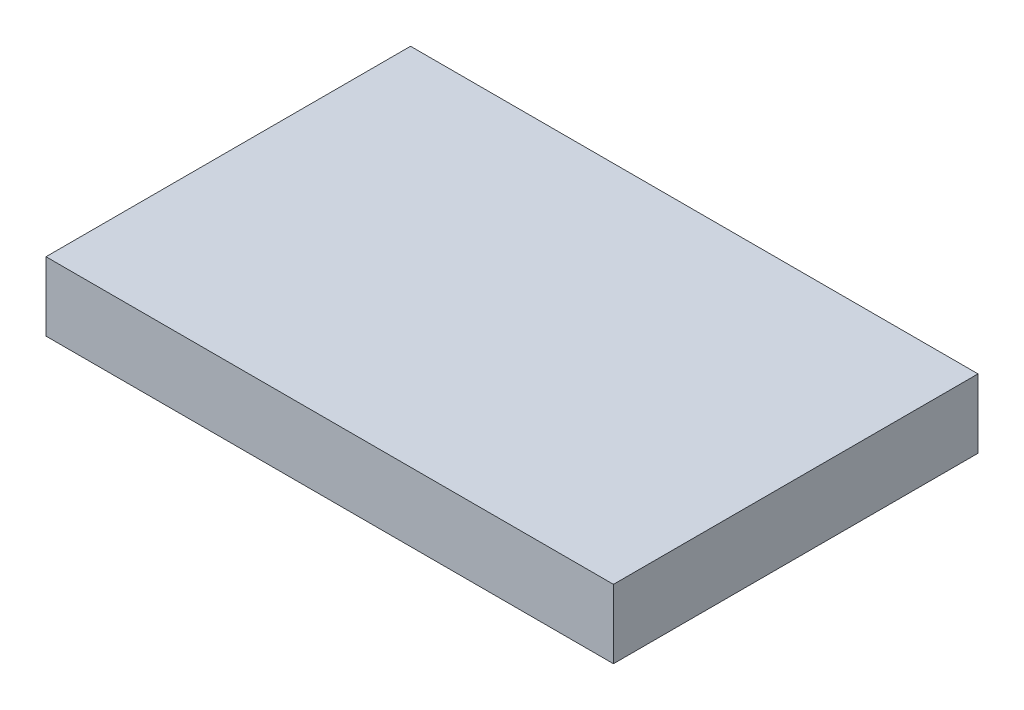
ISO-10303-21;
HEADER;
FILE_DESCRIPTION(('STEP AP214'),'2;1');
FILE_NAME('part.step','',(''),(''),'','','');
FILE_SCHEMA(('AUTOMOTIVE_DESIGN { 1 0 10303 214 1 1 1 1 }'));
ENDSEC;
DATA;
#1=APPLICATION_CONTEXT('core data for automotive mechanical design processes');
#2=APPLICATION_PROTOCOL_DEFINITION('international standard','automotive_design',2000,#1);
#3=PRODUCT_CONTEXT('',#1,'mechanical');
#4=PRODUCT('Part','Part','',(#3));
#5=PRODUCT_RELATED_PRODUCT_CATEGORY('part','',(#4));
#6=PRODUCT_DEFINITION_FORMATION('','',#4);
#7=PRODUCT_DEFINITION_CONTEXT('part definition',#1,'design');
#8=PRODUCT_DEFINITION('design','',#6,#7);
#9=PRODUCT_DEFINITION_SHAPE('','',#8);
#10=(LENGTH_UNIT() NAMED_UNIT(*) SI_UNIT(.MILLI.,.METRE.));
#11=(NAMED_UNIT(*) PLANE_ANGLE_UNIT() SI_UNIT($,.RADIAN.));
#12=(NAMED_UNIT(*) SI_UNIT($,.STERADIAN.) SOLID_ANGLE_UNIT());
#13=UNCERTAINTY_MEASURE_WITH_UNIT(LENGTH_MEASURE(1.E-05),#10,'distance_accuracy_value','');
#14=(GEOMETRIC_REPRESENTATION_CONTEXT(3) GLOBAL_UNCERTAINTY_ASSIGNED_CONTEXT((#13)) GLOBAL_UNIT_ASSIGNED_CONTEXT((#10,
#11,#12)) REPRESENTATION_CONTEXT('',''));
#15=CARTESIAN_POINT('',(0.,0.,0.));
#16=DIRECTION('',(0.,0.,1.));
#17=DIRECTION('',(1.,0.,0.));
#18=AXIS2_PLACEMENT_3D('',#15,#16,#17);
#19=CARTESIAN_POINT('',(41.25,10.,-26.5));
#20=DIRECTION('',(-1.,0.,0.));
#21=DIRECTION('',(0.,0.,1.));
#22=AXIS2_PLACEMENT_3D('',#19,#20,#21);
#23=PLANE('',#22);
#24=DIRECTION('',(0.,0.,-1.));
#25=VECTOR('',#24,1.);
#26=CARTESIAN_POINT('',(41.25,0.,-26.5));
#27=LINE('',#26,#25);
#28=CARTESIAN_POINT('',(41.25,0.,26.5));
#29=VERTEX_POINT('',#28);
#30=CARTESIAN_POINT('',(41.25,0.,-26.5));
#31=VERTEX_POINT('',#30);
#32=EDGE_CURVE('E107',#29,#31,#27,.T.);
#33=ORIENTED_EDGE('',*,*,#32,.T.);
#34=DIRECTION('',(0.,-1.,0.));
#35=VECTOR('',#34,1.);
#36=CARTESIAN_POINT('',(41.25,10.,-26.5));
#37=LINE('',#36,#35);
#38=CARTESIAN_POINT('',(41.25,10.,-26.5));
#39=VERTEX_POINT('',#38);
#40=EDGE_CURVE('E11',#39,#31,#37,.T.);
#41=ORIENTED_EDGE('',*,*,#40,.F.);
#42=DIRECTION('',(0.,0.,-1.));
#43=VECTOR('',#42,1.);
#44=CARTESIAN_POINT('',(41.25,10.,-26.5));
#45=LINE('',#44,#43);
#46=CARTESIAN_POINT('',(41.25,10.,26.5));
#47=VERTEX_POINT('',#46);
#48=EDGE_CURVE('E91',#47,#39,#45,.T.);
#49=ORIENTED_EDGE('',*,*,#48,.F.);
#50=DIRECTION('',(0.,-1.,0.));
#51=VECTOR('',#50,1.);
#52=CARTESIAN_POINT('',(41.25,10.,26.5));
#53=LINE('',#52,#51);
#54=EDGE_CURVE('E103',#47,#29,#53,.T.);
#55=ORIENTED_EDGE('',*,*,#54,.T.);
#56=EDGE_LOOP('',(#33,#41,#49,#55));
#57=FACE_BOUND('',#56,.T.);
#58=ADVANCED_FACE('F39',(#57),#23,.F.);
#59=CARTESIAN_POINT('',(-41.25,10.,-26.5));
#60=DIRECTION('',(0.,0.,1.));
#61=DIRECTION('',(1.,0.,0.));
#62=AXIS2_PLACEMENT_3D('',#59,#60,#61);
#63=PLANE('',#62);
#64=DIRECTION('',(-1.,0.,0.));
#65=VECTOR('',#64,1.);
#66=CARTESIAN_POINT('',(-41.25,0.,-26.5));
#67=LINE('',#66,#65);
#68=CARTESIAN_POINT('',(-41.25,0.,-26.5));
#69=VERTEX_POINT('',#68);
#70=EDGE_CURVE('E96',#31,#69,#67,.T.);
#71=ORIENTED_EDGE('',*,*,#70,.T.);
#72=DIRECTION('',(0.,-1.,0.));
#73=VECTOR('',#72,1.);
#74=CARTESIAN_POINT('',(-41.25,10.,-26.5));
#75=LINE('',#74,#73);
#76=CARTESIAN_POINT('',(-41.25,10.,-26.5));
#77=VERTEX_POINT('',#76);
#78=EDGE_CURVE('E48',#77,#69,#75,.T.);
#79=ORIENTED_EDGE('',*,*,#78,.F.);
#80=DIRECTION('',(-1.,0.,0.));
#81=VECTOR('',#80,1.);
#82=CARTESIAN_POINT('',(-41.25,10.,-26.5));
#83=LINE('',#82,#81);
#84=EDGE_CURVE('E86',#39,#77,#83,.T.);
#85=ORIENTED_EDGE('',*,*,#84,.F.);
#86=ORIENTED_EDGE('',*,*,#40,.T.);
#87=EDGE_LOOP('',(#71,#79,#85,#86));
#88=FACE_BOUND('',#87,.T.);
#89=ADVANCED_FACE('F95',(#88),#63,.F.);
#90=CARTESIAN_POINT('',(-41.25,10.,-26.5));
#91=DIRECTION('',(1.,0.,0.));
#92=DIRECTION('',(0.,0.,-1.));
#93=AXIS2_PLACEMENT_3D('',#90,#91,#92);
#94=PLANE('',#93);
#95=DIRECTION('',(0.,0.,1.));
#96=VECTOR('',#95,1.);
#97=CARTESIAN_POINT('',(-41.25,0.,-26.5));
#98=LINE('',#97,#96);
#99=CARTESIAN_POINT('',(-41.25,0.,26.5));
#100=VERTEX_POINT('',#99);
#101=EDGE_CURVE('E73',#69,#100,#98,.T.);
#102=ORIENTED_EDGE('',*,*,#101,.T.);
#103=DIRECTION('',(0.,-1.,0.));
#104=VECTOR('',#103,1.);
#105=CARTESIAN_POINT('',(-41.25,10.,26.5));
#106=LINE('',#105,#104);
#107=CARTESIAN_POINT('',(-41.25,10.,26.5));
#108=VERTEX_POINT('',#107);
#109=EDGE_CURVE('E98',#108,#100,#106,.T.);
#110=ORIENTED_EDGE('',*,*,#109,.F.);
#111=DIRECTION('',(0.,0.,1.));
#112=VECTOR('',#111,1.);
#113=CARTESIAN_POINT('',(-41.25,10.,-26.5));
#114=LINE('',#113,#112);
#115=EDGE_CURVE('E89',#77,#108,#114,.T.);
#116=ORIENTED_EDGE('',*,*,#115,.F.);
#117=ORIENTED_EDGE('',*,*,#78,.T.);
#118=EDGE_LOOP('',(#102,#110,#116,#117));
#119=FACE_BOUND('',#118,.T.);
#120=ADVANCED_FACE('F99',(#119),#94,.F.);
#121=CARTESIAN_POINT('',(-41.25,10.,26.5));
#122=DIRECTION('',(0.,0.,-1.));
#123=DIRECTION('',(-1.,0.,0.));
#124=AXIS2_PLACEMENT_3D('',#121,#122,#123);
#125=PLANE('',#124);
#126=DIRECTION('',(1.,0.,0.));
#127=VECTOR('',#126,1.);
#128=CARTESIAN_POINT('',(-41.25,0.,26.5));
#129=LINE('',#128,#127);
#130=EDGE_CURVE('E79',#100,#29,#129,.T.);
#131=ORIENTED_EDGE('',*,*,#130,.T.);
#132=ORIENTED_EDGE('',*,*,#54,.F.);
#133=DIRECTION('',(1.,0.,0.));
#134=VECTOR('',#133,1.);
#135=CARTESIAN_POINT('',(-41.25,10.,26.5));
#136=LINE('',#135,#134);
#137=EDGE_CURVE('E56',#108,#47,#136,.T.);
#138=ORIENTED_EDGE('',*,*,#137,.F.);
#139=ORIENTED_EDGE('',*,*,#109,.T.);
#140=EDGE_LOOP('',(#131,#132,#138,#139));
#141=FACE_BOUND('',#140,.T.);
#142=ADVANCED_FACE('F120',(#141),#125,.F.);
#143=CARTESIAN_POINT('',(0.,10.,0.));
#144=DIRECTION('',(0.,1.,0.));
#145=DIRECTION('',(0.,0.,1.));
#146=AXIS2_PLACEMENT_3D('',#143,#144,#145);
#147=PLANE('',#146);
#148=ORIENTED_EDGE('',*,*,#48,.T.);
#149=ORIENTED_EDGE('',*,*,#84,.T.);
#150=ORIENTED_EDGE('',*,*,#115,.T.);
#151=ORIENTED_EDGE('',*,*,#137,.T.);
#152=EDGE_LOOP('',(#148,#149,#150,#151));
#153=FACE_BOUND('',#152,.T.);
#154=ADVANCED_FACE('F87',(#153),#147,.T.);
#155=CARTESIAN_POINT('',(0.,0.,0.));
#156=DIRECTION('',(0.,1.,0.));
#157=DIRECTION('',(0.,0.,1.));
#158=AXIS2_PLACEMENT_3D('',#155,#156,#157);
#159=PLANE('',#158);
#160=ORIENTED_EDGE('',*,*,#32,.F.);
#161=ORIENTED_EDGE('',*,*,#130,.F.);
#162=ORIENTED_EDGE('',*,*,#101,.F.);
#163=ORIENTED_EDGE('',*,*,#70,.F.);
#164=EDGE_LOOP('',(#160,#161,#162,#163));
#165=FACE_BOUND('',#164,.T.);
#166=ADVANCED_FACE('F123',(#165),#159,.F.);
#167=CLOSED_SHELL('',(#58,#89,#120,#142,#154,#166));
#168=MANIFOLD_SOLID_BREP('B2',#167);
#169=ADVANCED_BREP_SHAPE_REPRESENTATION('',(#18,#168),#14);
#170=SHAPE_DEFINITION_REPRESENTATION(#9,#169);
ENDSEC;
END-ISO-10303-21;
